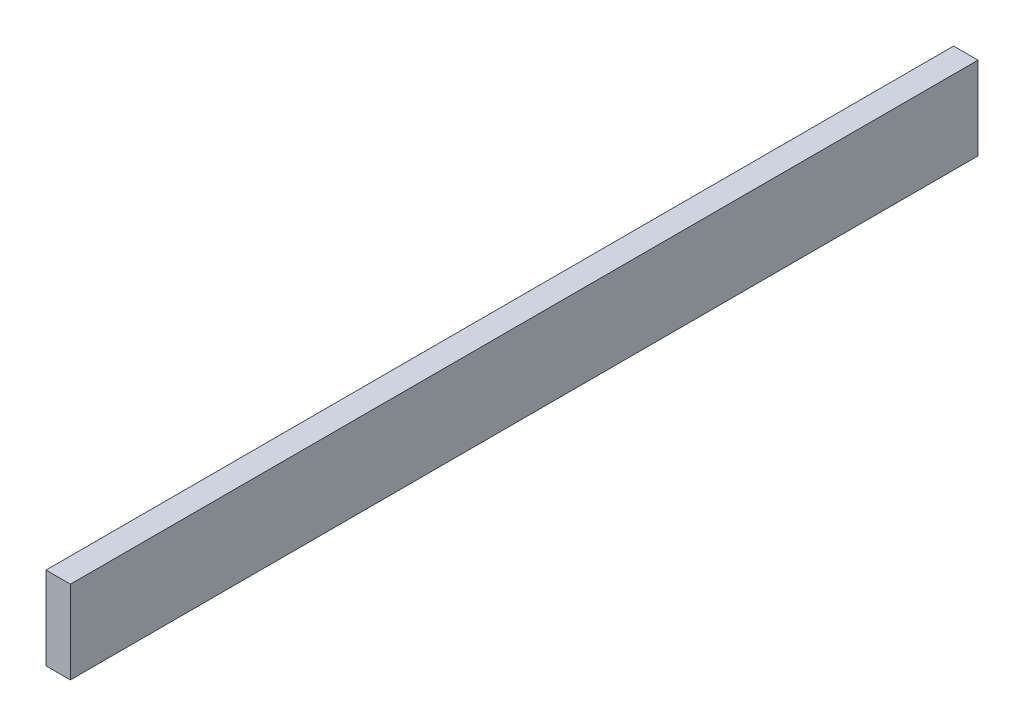
ISO-10303-21;
HEADER;
FILE_DESCRIPTION(('STEP AP214'),'2;1');
FILE_NAME('part.step','',(''),(''),'','','');
FILE_SCHEMA(('AUTOMOTIVE_DESIGN { 1 0 10303 214 1 1 1 1 }'));
ENDSEC;
DATA;
#1=APPLICATION_CONTEXT('core data for automotive mechanical design processes');
#2=APPLICATION_PROTOCOL_DEFINITION('international standard','automotive_design',2000,#1);
#3=PRODUCT_CONTEXT('',#1,'mechanical');
#4=PRODUCT('Part','Part','',(#3));
#5=PRODUCT_RELATED_PRODUCT_CATEGORY('part','',(#4));
#6=PRODUCT_DEFINITION_FORMATION('','',#4);
#7=PRODUCT_DEFINITION_CONTEXT('part definition',#1,'design');
#8=PRODUCT_DEFINITION('design','',#6,#7);
#9=PRODUCT_DEFINITION_SHAPE('','',#8);
#10=(LENGTH_UNIT() NAMED_UNIT(*) SI_UNIT(.MILLI.,.METRE.));
#11=(NAMED_UNIT(*) PLANE_ANGLE_UNIT() SI_UNIT($,.RADIAN.));
#12=(NAMED_UNIT(*) SI_UNIT($,.STERADIAN.) SOLID_ANGLE_UNIT());
#13=UNCERTAINTY_MEASURE_WITH_UNIT(LENGTH_MEASURE(1.E-05),#10,'distance_accuracy_value','');
#14=(GEOMETRIC_REPRESENTATION_CONTEXT(3) GLOBAL_UNCERTAINTY_ASSIGNED_CONTEXT((#13)) GLOBAL_UNIT_ASSIGNED_CONTEXT((#10,
#11,#12)) REPRESENTATION_CONTEXT('',''));
#15=CARTESIAN_POINT('',(0.,0.,0.));
#16=DIRECTION('',(0.,0.,1.));
#17=DIRECTION('',(1.,0.,0.));
#18=AXIS2_PLACEMENT_3D('',#15,#16,#17);
#19=CARTESIAN_POINT('',(5.,0.,0.));
#20=DIRECTION('',(0.,0.,-1.));
#21=DIRECTION('',(-1.,0.,0.));
#22=AXIS2_PLACEMENT_3D('',#19,#20,#21);
#23=PLANE('',#22);
#24=DIRECTION('',(0.,-1.,0.));
#25=VECTOR('',#24,1.);
#26=CARTESIAN_POINT('',(0.,0.,0.));
#27=LINE('',#26,#25);
#28=CARTESIAN_POINT('',(0.,17.,0.));
#29=VERTEX_POINT('',#28);
#30=CARTESIAN_POINT('',(0.,0.,0.));
#31=VERTEX_POINT('',#30);
#32=EDGE_CURVE('E96',#29,#31,#27,.T.);
#33=ORIENTED_EDGE('',*,*,#32,.T.);
#34=DIRECTION('',(-1.,0.,0.));
#35=VECTOR('',#34,1.);
#36=CARTESIAN_POINT('',(5.,0.,0.));
#37=LINE('',#36,#35);
#38=CARTESIAN_POINT('',(5.,0.,0.));
#39=VERTEX_POINT('',#38);
#40=EDGE_CURVE('E11',#39,#31,#37,.T.);
#41=ORIENTED_EDGE('',*,*,#40,.F.);
#42=DIRECTION('',(0.,-1.,0.));
#43=VECTOR('',#42,1.);
#44=CARTESIAN_POINT('',(5.,0.,0.));
#45=LINE('',#44,#43);
#46=CARTESIAN_POINT('',(5.,17.,0.));
#47=VERTEX_POINT('',#46);
#48=EDGE_CURVE('E84',#47,#39,#45,.T.);
#49=ORIENTED_EDGE('',*,*,#48,.F.);
#50=DIRECTION('',(-1.,0.,0.));
#51=VECTOR('',#50,1.);
#52=CARTESIAN_POINT('',(5.,17.,0.));
#53=LINE('',#52,#51);
#54=EDGE_CURVE('E92',#47,#29,#53,.T.);
#55=ORIENTED_EDGE('',*,*,#54,.T.);
#56=EDGE_LOOP('',(#33,#41,#49,#55));
#57=FACE_BOUND('',#56,.T.);
#58=ADVANCED_FACE('F33',(#57),#23,.F.);
#59=CARTESIAN_POINT('',(5.,0.,0.));
#60=DIRECTION('',(0.,1.,0.));
#61=DIRECTION('',(0.,0.,1.));
#62=AXIS2_PLACEMENT_3D('',#59,#60,#61);
#63=PLANE('',#62);
#64=DIRECTION('',(0.,0.,-1.));
#65=VECTOR('',#64,1.);
#66=CARTESIAN_POINT('',(0.,0.,0.));
#67=LINE('',#66,#65);
#68=CARTESIAN_POINT('',(0.,0.,-186.));
#69=VERTEX_POINT('',#68);
#70=EDGE_CURVE('E88',#31,#69,#67,.T.);
#71=ORIENTED_EDGE('',*,*,#70,.T.);
#72=DIRECTION('',(-1.,0.,0.));
#73=VECTOR('',#72,1.);
#74=CARTESIAN_POINT('',(5.,0.,-186.));
#75=LINE('',#74,#73);
#76=CARTESIAN_POINT('',(5.,0.,-186.));
#77=VERTEX_POINT('',#76);
#78=EDGE_CURVE('E41',#77,#69,#75,.T.);
#79=ORIENTED_EDGE('',*,*,#78,.F.);
#80=DIRECTION('',(0.,0.,-1.));
#81=VECTOR('',#80,1.);
#82=CARTESIAN_POINT('',(5.,0.,0.));
#83=LINE('',#82,#81);
#84=EDGE_CURVE('E79',#39,#77,#83,.T.);
#85=ORIENTED_EDGE('',*,*,#84,.F.);
#86=ORIENTED_EDGE('',*,*,#40,.T.);
#87=EDGE_LOOP('',(#71,#79,#85,#86));
#88=FACE_BOUND('',#87,.T.);
#89=ADVANCED_FACE('F87',(#88),#63,.F.);
#90=CARTESIAN_POINT('',(5.,0.,-186.));
#91=DIRECTION('',(0.,0.,1.));
#92=DIRECTION('',(1.,0.,0.));
#93=AXIS2_PLACEMENT_3D('',#90,#91,#92);
#94=PLANE('',#93);
#95=DIRECTION('',(0.,1.,0.));
#96=VECTOR('',#95,1.);
#97=CARTESIAN_POINT('',(0.,0.,-186.));
#98=LINE('',#97,#96);
#99=CARTESIAN_POINT('',(0.,17.,-186.));
#100=VERTEX_POINT('',#99);
#101=EDGE_CURVE('E66',#69,#100,#98,.T.);
#102=ORIENTED_EDGE('',*,*,#101,.T.);
#103=DIRECTION('',(-1.,0.,0.));
#104=VECTOR('',#103,1.);
#105=CARTESIAN_POINT('',(5.,17.,-186.));
#106=LINE('',#105,#104);
#107=CARTESIAN_POINT('',(5.,17.,-186.));
#108=VERTEX_POINT('',#107);
#109=EDGE_CURVE('E89',#108,#100,#106,.T.);
#110=ORIENTED_EDGE('',*,*,#109,.F.);
#111=DIRECTION('',(0.,1.,0.));
#112=VECTOR('',#111,1.);
#113=CARTESIAN_POINT('',(5.,0.,-186.));
#114=LINE('',#113,#112);
#115=EDGE_CURVE('E82',#77,#108,#114,.T.);
#116=ORIENTED_EDGE('',*,*,#115,.F.);
#117=ORIENTED_EDGE('',*,*,#78,.T.);
#118=EDGE_LOOP('',(#102,#110,#116,#117));
#119=FACE_BOUND('',#118,.T.);
#120=ADVANCED_FACE('F90',(#119),#94,.F.);
#121=CARTESIAN_POINT('',(5.,17.,0.));
#122=DIRECTION('',(0.,-1.,0.));
#123=DIRECTION('',(0.,0.,-1.));
#124=AXIS2_PLACEMENT_3D('',#121,#122,#123);
#125=PLANE('',#124);
#126=DIRECTION('',(0.,0.,1.));
#127=VECTOR('',#126,1.);
#128=CARTESIAN_POINT('',(0.,17.,0.));
#129=LINE('',#128,#127);
#130=EDGE_CURVE('E72',#100,#29,#129,.T.);
#131=ORIENTED_EDGE('',*,*,#130,.T.);
#132=ORIENTED_EDGE('',*,*,#54,.F.);
#133=DIRECTION('',(0.,0.,1.));
#134=VECTOR('',#133,1.);
#135=CARTESIAN_POINT('',(5.,17.,0.));
#136=LINE('',#135,#134);
#137=EDGE_CURVE('E49',#108,#47,#136,.T.);
#138=ORIENTED_EDGE('',*,*,#137,.F.);
#139=ORIENTED_EDGE('',*,*,#109,.T.);
#140=EDGE_LOOP('',(#131,#132,#138,#139));
#141=FACE_BOUND('',#140,.T.);
#142=ADVANCED_FACE('F103',(#141),#125,.F.);
#143=CARTESIAN_POINT('',(5.,0.,0.));
#144=DIRECTION('',(-1.,0.,0.));
#145=DIRECTION('',(0.,0.,1.));
#146=AXIS2_PLACEMENT_3D('',#143,#144,#145);
#147=PLANE('',#146);
#148=ORIENTED_EDGE('',*,*,#48,.T.);
#149=ORIENTED_EDGE('',*,*,#84,.T.);
#150=ORIENTED_EDGE('',*,*,#115,.T.);
#151=ORIENTED_EDGE('',*,*,#137,.T.);
#152=EDGE_LOOP('',(#148,#149,#150,#151));
#153=FACE_BOUND('',#152,.T.);
#154=ADVANCED_FACE('F80',(#153),#147,.F.);
#155=CARTESIAN_POINT('',(0.,0.,0.));
#156=DIRECTION('',(-1.,0.,0.));
#157=DIRECTION('',(0.,0.,1.));
#158=AXIS2_PLACEMENT_3D('',#155,#156,#157);
#159=PLANE('',#158);
#160=ORIENTED_EDGE('',*,*,#32,.F.);
#161=ORIENTED_EDGE('',*,*,#130,.F.);
#162=ORIENTED_EDGE('',*,*,#101,.F.);
#163=ORIENTED_EDGE('',*,*,#70,.F.);
#164=EDGE_LOOP('',(#160,#161,#162,#163));
#165=FACE_BOUND('',#164,.T.);
#166=ADVANCED_FACE('F106',(#165),#159,.T.);
#167=CLOSED_SHELL('',(#58,#89,#120,#142,#154,#166));
#168=MANIFOLD_SOLID_BREP('B2',#167);
#169=ADVANCED_BREP_SHAPE_REPRESENTATION('',(#18,#168),#14);
#170=SHAPE_DEFINITION_REPRESENTATION(#9,#169);
ENDSEC;
END-ISO-10303-21;
